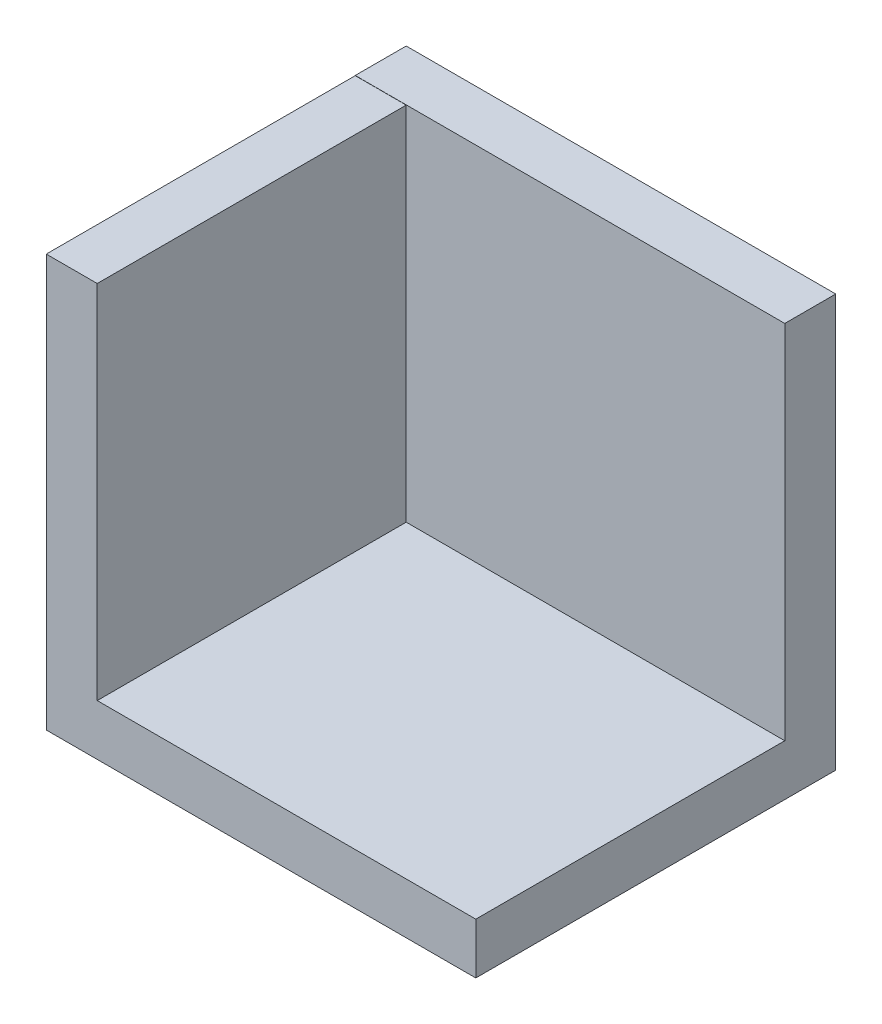
ISO-10303-21;
HEADER;
FILE_DESCRIPTION(('STEP AP214'),'2;1');
FILE_NAME('part.step','',(''),(''),'','','');
FILE_SCHEMA(('AUTOMOTIVE_DESIGN { 1 0 10303 214 1 1 1 1 }'));
ENDSEC;
DATA;
#1=APPLICATION_CONTEXT('core data for automotive mechanical design processes');
#2=APPLICATION_PROTOCOL_DEFINITION('international standard','automotive_design',2000,#1);
#3=PRODUCT_CONTEXT('',#1,'mechanical');
#4=PRODUCT('Part','Part','',(#3));
#5=PRODUCT_RELATED_PRODUCT_CATEGORY('part','',(#4));
#6=PRODUCT_DEFINITION_FORMATION('','',#4);
#7=PRODUCT_DEFINITION_CONTEXT('part definition',#1,'design');
#8=PRODUCT_DEFINITION('design','',#6,#7);
#9=PRODUCT_DEFINITION_SHAPE('','',#8);
#10=(LENGTH_UNIT() NAMED_UNIT(*) SI_UNIT(.MILLI.,.METRE.));
#11=(NAMED_UNIT(*) PLANE_ANGLE_UNIT() SI_UNIT($,.RADIAN.));
#12=(NAMED_UNIT(*) SI_UNIT($,.STERADIAN.) SOLID_ANGLE_UNIT());
#13=UNCERTAINTY_MEASURE_WITH_UNIT(LENGTH_MEASURE(1.E-05),#10,'distance_accuracy_value','');
#14=(GEOMETRIC_REPRESENTATION_CONTEXT(3) GLOBAL_UNCERTAINTY_ASSIGNED_CONTEXT((#13)) GLOBAL_UNIT_ASSIGNED_CONTEXT((#10,
#11,#12)) REPRESENTATION_CONTEXT('',''));
#15=CARTESIAN_POINT('',(0.,0.,0.));
#16=DIRECTION('',(0.,0.,1.));
#17=DIRECTION('',(1.,0.,0.));
#18=AXIS2_PLACEMENT_3D('',#15,#16,#17);
#19=CARTESIAN_POINT('',(-80.264,9.525,0.));
#20=DIRECTION('',(0.,0.,1.));
#21=DIRECTION('',(0.,-1.,0.));
#22=AXIS2_PLACEMENT_3D('',#19,#20,#21);
#23=PLANE('',#22);
#24=DIRECTION('',(0.,-1.,0.));
#25=VECTOR('',#24,1.);
#26=CARTESIAN_POINT('',(0.,9.525,0.));
#27=LINE('',#26,#25);
#28=CARTESIAN_POINT('',(0.,9.525,0.));
#29=VERTEX_POINT('',#28);
#30=CARTESIAN_POINT('',(0.,0.,0.));
#31=VERTEX_POINT('',#30);
#32=EDGE_CURVE('E119',#29,#31,#27,.T.);
#33=ORIENTED_EDGE('',*,*,#32,.F.);
#34=DIRECTION('',(1.,0.,0.));
#35=VECTOR('',#34,1.);
#36=CARTESIAN_POINT('',(-80.264,9.525,0.));
#37=LINE('',#36,#35);
#38=CARTESIAN_POINT('',(-70.739,9.525,0.));
#39=VERTEX_POINT('',#38);
#40=EDGE_CURVE('E11',#39,#29,#37,.T.);
#41=ORIENTED_EDGE('',*,*,#40,.F.);
#42=DIRECTION('',(0.,1.,0.));
#43=VECTOR('',#42,1.);
#44=CARTESIAN_POINT('',(-70.739,9.52500000000001,0.));
#45=LINE('',#44,#43);
#46=CARTESIAN_POINT('',(-70.739,77.0206639224271,0.));
#47=VERTEX_POINT('',#46);
#48=EDGE_CURVE('E109',#39,#47,#45,.T.);
#49=ORIENTED_EDGE('',*,*,#48,.T.);
#50=DIRECTION('',(-1.,0.,0.));
#51=VECTOR('',#50,1.);
#52=CARTESIAN_POINT('',(-70.739,77.0206639224271,0.));
#53=LINE('',#52,#51);
#54=CARTESIAN_POINT('',(-80.264,77.0206639224271,0.));
#55=VERTEX_POINT('',#54);
#56=EDGE_CURVE('E98',#47,#55,#53,.T.);
#57=ORIENTED_EDGE('',*,*,#56,.T.);
#58=DIRECTION('',(0.,-1.,0.));
#59=VECTOR('',#58,1.);
#60=CARTESIAN_POINT('',(-80.264,9.525,0.));
#61=LINE('',#60,#59);
#62=CARTESIAN_POINT('',(-80.264,0.,0.));
#63=VERTEX_POINT('',#62);
#64=EDGE_CURVE('E121',#55,#63,#61,.T.);
#65=ORIENTED_EDGE('',*,*,#64,.T.);
#66=DIRECTION('',(1.,0.,0.));
#67=VECTOR('',#66,1.);
#68=CARTESIAN_POINT('',(-80.264,0.,0.));
#69=LINE('',#68,#67);
#70=EDGE_CURVE('E34',#63,#31,#69,.T.);
#71=ORIENTED_EDGE('',*,*,#70,.T.);
#72=EDGE_LOOP('',(#33,#41,#49,#57,#65,#71));
#73=FACE_BOUND('',#72,.T.);
#74=ADVANCED_FACE('F31',(#73),#23,.T.);
#75=CARTESIAN_POINT('',(-80.264,9.52500000000001,-57.7374461725799));
#76=DIRECTION('',(0.,1.,0.));
#77=DIRECTION('',(0.,0.,1.));
#78=AXIS2_PLACEMENT_3D('',#75,#76,#77);
#79=PLANE('',#78);
#80=DIRECTION('',(0.,0.,1.));
#81=VECTOR('',#80,1.);
#82=CARTESIAN_POINT('',(-70.739,9.52500000000001,-57.7374461725799));
#83=LINE('',#82,#81);
#84=CARTESIAN_POINT('',(-70.739,9.52500000000001,-57.7374461725799));
#85=VERTEX_POINT('',#84);
#86=EDGE_CURVE('E46',#85,#39,#83,.T.);
#87=ORIENTED_EDGE('',*,*,#86,.T.);
#88=ORIENTED_EDGE('',*,*,#40,.T.);
#89=DIRECTION('',(0.,0.,1.));
#90=VECTOR('',#89,1.);
#91=CARTESIAN_POINT('',(0.,9.52500000000001,-57.7374461725799));
#92=LINE('',#91,#90);
#93=CARTESIAN_POINT('',(0.,9.52500000000001,-57.7374461725799));
#94=VERTEX_POINT('',#93);
#95=EDGE_CURVE('E124',#94,#29,#92,.T.);
#96=ORIENTED_EDGE('',*,*,#95,.F.);
#97=DIRECTION('',(1.,0.,0.));
#98=VECTOR('',#97,1.);
#99=CARTESIAN_POINT('',(-80.264,9.52500000000001,-57.7374461725799));
#100=LINE('',#99,#98);
#101=EDGE_CURVE('E39',#85,#94,#100,.T.);
#102=ORIENTED_EDGE('',*,*,#101,.F.);
#103=EDGE_LOOP('',(#87,#88,#96,#102));
#104=FACE_BOUND('',#103,.T.);
#105=ADVANCED_FACE('F165',(#104),#79,.T.);
#106=CARTESIAN_POINT('',(-80.264,77.0602216748769,-57.7374461725799));
#107=DIRECTION('',(0.,0.,1.));
#108=DIRECTION('',(0.,-1.,0.));
#109=AXIS2_PLACEMENT_3D('',#106,#107,#108);
#110=PLANE('',#109);
#111=DIRECTION('',(-1.,0.,0.));
#112=VECTOR('',#111,1.);
#113=CARTESIAN_POINT('',(-70.739,77.0206639224271,-57.7374461725799));
#114=LINE('',#113,#112);
#115=CARTESIAN_POINT('',(-70.739,77.0206639224271,-57.7374461725799));
#116=VERTEX_POINT('',#115);
#117=CARTESIAN_POINT('',(-80.264,77.0206639224271,-57.7374461725799));
#118=VERTEX_POINT('',#117);
#119=EDGE_CURVE('E54',#116,#118,#114,.T.);
#120=ORIENTED_EDGE('',*,*,#119,.F.);
#121=DIRECTION('',(0.,-1.,0.));
#122=VECTOR('',#121,1.);
#123=CARTESIAN_POINT('',(-70.739,9.52500000000001,-57.7374461725799));
#124=LINE('',#123,#122);
#125=EDGE_CURVE('E114',#116,#85,#124,.T.);
#126=ORIENTED_EDGE('',*,*,#125,.T.);
#127=ORIENTED_EDGE('',*,*,#101,.T.);
#128=DIRECTION('',(0.,-1.,0.));
#129=VECTOR('',#128,1.);
#130=CARTESIAN_POINT('',(0.,77.0602216748769,-57.7374461725799));
#131=LINE('',#130,#129);
#132=CARTESIAN_POINT('',(0.,77.0602216748769,-57.7374461725799));
#133=VERTEX_POINT('',#132);
#134=EDGE_CURVE('E146',#133,#94,#131,.T.);
#135=ORIENTED_EDGE('',*,*,#134,.F.);
#136=DIRECTION('',(1.,0.,0.));
#137=VECTOR('',#136,1.);
#138=CARTESIAN_POINT('',(-80.264,77.0602216748769,-57.7374461725799));
#139=LINE('',#138,#137);
#140=CARTESIAN_POINT('',(-80.264,77.0602216748769,-57.7374461725799));
#141=VERTEX_POINT('',#140);
#142=EDGE_CURVE('E152',#141,#133,#139,.T.);
#143=ORIENTED_EDGE('',*,*,#142,.F.);
#144=DIRECTION('',(0.,-1.,0.));
#145=VECTOR('',#144,1.);
#146=CARTESIAN_POINT('',(-80.264,77.0602216748769,-57.7374461725799));
#147=LINE('',#146,#145);
#148=EDGE_CURVE('E133',#141,#118,#147,.T.);
#149=ORIENTED_EDGE('',*,*,#148,.T.);
#150=EDGE_LOOP('',(#120,#126,#127,#135,#143,#149));
#151=FACE_BOUND('',#150,.T.);
#152=ADVANCED_FACE('F167',(#151),#110,.T.);
#153=CARTESIAN_POINT('',(-80.264,77.0602216748769,-67.2624461725799));
#154=DIRECTION('',(0.,1.,0.));
#155=DIRECTION('',(0.,0.,1.));
#156=AXIS2_PLACEMENT_3D('',#153,#154,#155);
#157=PLANE('',#156);
#158=DIRECTION('',(0.,0.,1.));
#159=VECTOR('',#158,1.);
#160=CARTESIAN_POINT('',(0.,77.0602216748769,-67.2624461725799));
#161=LINE('',#160,#159);
#162=CARTESIAN_POINT('',(0.,77.0602216748769,-67.2624461725799));
#163=VERTEX_POINT('',#162);
#164=EDGE_CURVE('E143',#163,#133,#161,.T.);
#165=ORIENTED_EDGE('',*,*,#164,.F.);
#166=DIRECTION('',(1.,0.,0.));
#167=VECTOR('',#166,1.);
#168=CARTESIAN_POINT('',(-80.264,77.0602216748769,-67.2624461725799));
#169=LINE('',#168,#167);
#170=CARTESIAN_POINT('',(-80.264,77.0602216748769,-67.2624461725799));
#171=VERTEX_POINT('',#170);
#172=EDGE_CURVE('E154',#171,#163,#169,.T.);
#173=ORIENTED_EDGE('',*,*,#172,.F.);
#174=DIRECTION('',(0.,0.,1.));
#175=VECTOR('',#174,1.);
#176=CARTESIAN_POINT('',(-80.264,77.0602216748769,-67.2624461725799));
#177=LINE('',#176,#175);
#178=EDGE_CURVE('E130',#171,#141,#177,.T.);
#179=ORIENTED_EDGE('',*,*,#178,.T.);
#180=ORIENTED_EDGE('',*,*,#142,.T.);
#181=EDGE_LOOP('',(#165,#173,#179,#180));
#182=FACE_BOUND('',#181,.T.);
#183=ADVANCED_FACE('F169',(#182),#157,.T.);
#184=CARTESIAN_POINT('',(-80.264,0.,-67.2624461725799));
#185=DIRECTION('',(0.,0.,-1.));
#186=DIRECTION('',(-1.,0.,0.));
#187=AXIS2_PLACEMENT_3D('',#184,#185,#186);
#188=PLANE('',#187);
#189=DIRECTION('',(0.,1.,0.));
#190=VECTOR('',#189,1.);
#191=CARTESIAN_POINT('',(0.,0.,-67.2624461725799));
#192=LINE('',#191,#190);
#193=CARTESIAN_POINT('',(0.,0.,-67.2624461725799));
#194=VERTEX_POINT('',#193);
#195=EDGE_CURVE('E140',#194,#163,#192,.T.);
#196=ORIENTED_EDGE('',*,*,#195,.F.);
#197=DIRECTION('',(1.,0.,0.));
#198=VECTOR('',#197,1.);
#199=CARTESIAN_POINT('',(-80.264,0.,-67.2624461725799));
#200=LINE('',#199,#198);
#201=CARTESIAN_POINT('',(-80.264,0.,-67.2624461725799));
#202=VERTEX_POINT('',#201);
#203=EDGE_CURVE('E155',#202,#194,#200,.T.);
#204=ORIENTED_EDGE('',*,*,#203,.F.);
#205=DIRECTION('',(0.,1.,0.));
#206=VECTOR('',#205,1.);
#207=CARTESIAN_POINT('',(-80.264,0.,-67.2624461725799));
#208=LINE('',#207,#206);
#209=EDGE_CURVE('E127',#202,#171,#208,.T.);
#210=ORIENTED_EDGE('',*,*,#209,.T.);
#211=ORIENTED_EDGE('',*,*,#172,.T.);
#212=EDGE_LOOP('',(#196,#204,#210,#211));
#213=FACE_BOUND('',#212,.T.);
#214=ADVANCED_FACE('F175',(#213),#188,.T.);
#215=CARTESIAN_POINT('',(-80.264,0.,0.));
#216=DIRECTION('',(0.,-1.,0.));
#217=DIRECTION('',(0.,0.,-1.));
#218=AXIS2_PLACEMENT_3D('',#215,#216,#217);
#219=PLANE('',#218);
#220=DIRECTION('',(0.,0.,-1.));
#221=VECTOR('',#220,1.);
#222=CARTESIAN_POINT('',(0.,0.,0.));
#223=LINE('',#222,#221);
#224=EDGE_CURVE('E137',#31,#194,#223,.T.);
#225=ORIENTED_EDGE('',*,*,#224,.F.);
#226=ORIENTED_EDGE('',*,*,#70,.F.);
#227=DIRECTION('',(0.,0.,-1.));
#228=VECTOR('',#227,1.);
#229=CARTESIAN_POINT('',(-80.264,0.,0.));
#230=LINE('',#229,#228);
#231=EDGE_CURVE('E123',#63,#202,#230,.T.);
#232=ORIENTED_EDGE('',*,*,#231,.T.);
#233=ORIENTED_EDGE('',*,*,#203,.T.);
#234=EDGE_LOOP('',(#225,#226,#232,#233));
#235=FACE_BOUND('',#234,.T.);
#236=ADVANCED_FACE('F160',(#235),#219,.T.);
#237=CARTESIAN_POINT('',(-80.264,0.,0.));
#238=DIRECTION('',(1.,0.,0.));
#239=DIRECTION('',(0.,0.,-1.));
#240=AXIS2_PLACEMENT_3D('',#237,#238,#239);
#241=PLANE('',#240);
#242=ORIENTED_EDGE('',*,*,#64,.F.);
#243=DIRECTION('',(0.,0.,-1.));
#244=VECTOR('',#243,1.);
#245=CARTESIAN_POINT('',(-80.264,77.0206639224271,-57.7374461725799));
#246=LINE('',#245,#244);
#247=EDGE_CURVE('E104',#55,#118,#246,.T.);
#248=ORIENTED_EDGE('',*,*,#247,.T.);
#249=ORIENTED_EDGE('',*,*,#148,.F.);
#250=ORIENTED_EDGE('',*,*,#178,.F.);
#251=ORIENTED_EDGE('',*,*,#209,.F.);
#252=ORIENTED_EDGE('',*,*,#231,.F.);
#253=EDGE_LOOP('',(#242,#248,#249,#250,#251,#252));
#254=FACE_BOUND('',#253,.T.);
#255=ADVANCED_FACE('F198',(#254),#241,.F.);
#256=CARTESIAN_POINT('',(0.,0.,0.));
#257=DIRECTION('',(1.,0.,0.));
#258=DIRECTION('',(0.,0.,-1.));
#259=AXIS2_PLACEMENT_3D('',#256,#257,#258);
#260=PLANE('',#259);
#261=ORIENTED_EDGE('',*,*,#32,.T.);
#262=ORIENTED_EDGE('',*,*,#224,.T.);
#263=ORIENTED_EDGE('',*,*,#195,.T.);
#264=ORIENTED_EDGE('',*,*,#164,.T.);
#265=ORIENTED_EDGE('',*,*,#134,.T.);
#266=ORIENTED_EDGE('',*,*,#95,.T.);
#267=EDGE_LOOP('',(#261,#262,#263,#264,#265,#266));
#268=FACE_BOUND('',#267,.T.);
#269=ADVANCED_FACE('F162',(#268),#260,.T.);
#270=CARTESIAN_POINT('',(-70.739,77.0206639224271,-57.7374461725799));
#271=DIRECTION('',(0.,1.,0.));
#272=DIRECTION('',(0.,0.,1.));
#273=AXIS2_PLACEMENT_3D('',#270,#271,#272);
#274=PLANE('',#273);
#275=ORIENTED_EDGE('',*,*,#247,.F.);
#276=ORIENTED_EDGE('',*,*,#56,.F.);
#277=DIRECTION('',(0.,0.,-1.));
#278=VECTOR('',#277,1.);
#279=CARTESIAN_POINT('',(-70.739,77.0206639224271,-57.7374461725799));
#280=LINE('',#279,#278);
#281=EDGE_CURVE('E102',#47,#116,#280,.T.);
#282=ORIENTED_EDGE('',*,*,#281,.T.);
#283=ORIENTED_EDGE('',*,*,#119,.T.);
#284=EDGE_LOOP('',(#275,#276,#282,#283));
#285=FACE_BOUND('',#284,.T.);
#286=ADVANCED_FACE('F100',(#285),#274,.T.);
#287=CARTESIAN_POINT('',(-70.739,77.0206639224271,-57.7374461725799));
#288=DIRECTION('',(1.,0.,0.));
#289=DIRECTION('',(0.,0.,-1.));
#290=AXIS2_PLACEMENT_3D('',#287,#288,#289);
#291=PLANE('',#290);
#292=ORIENTED_EDGE('',*,*,#125,.F.);
#293=ORIENTED_EDGE('',*,*,#281,.F.);
#294=ORIENTED_EDGE('',*,*,#48,.F.);
#295=ORIENTED_EDGE('',*,*,#86,.F.);
#296=EDGE_LOOP('',(#292,#293,#294,#295));
#297=FACE_BOUND('',#296,.T.);
#298=ADVANCED_FACE('F113',(#297),#291,.T.);
#299=CLOSED_SHELL('',(#74,#105,#152,#183,#214,#236,#255,#269,#286,#298));
#300=MANIFOLD_SOLID_BREP('B2',#299);
#301=ADVANCED_BREP_SHAPE_REPRESENTATION('',(#18,#300),#14);
#302=SHAPE_DEFINITION_REPRESENTATION(#9,#301);
ENDSEC;
END-ISO-10303-21;
